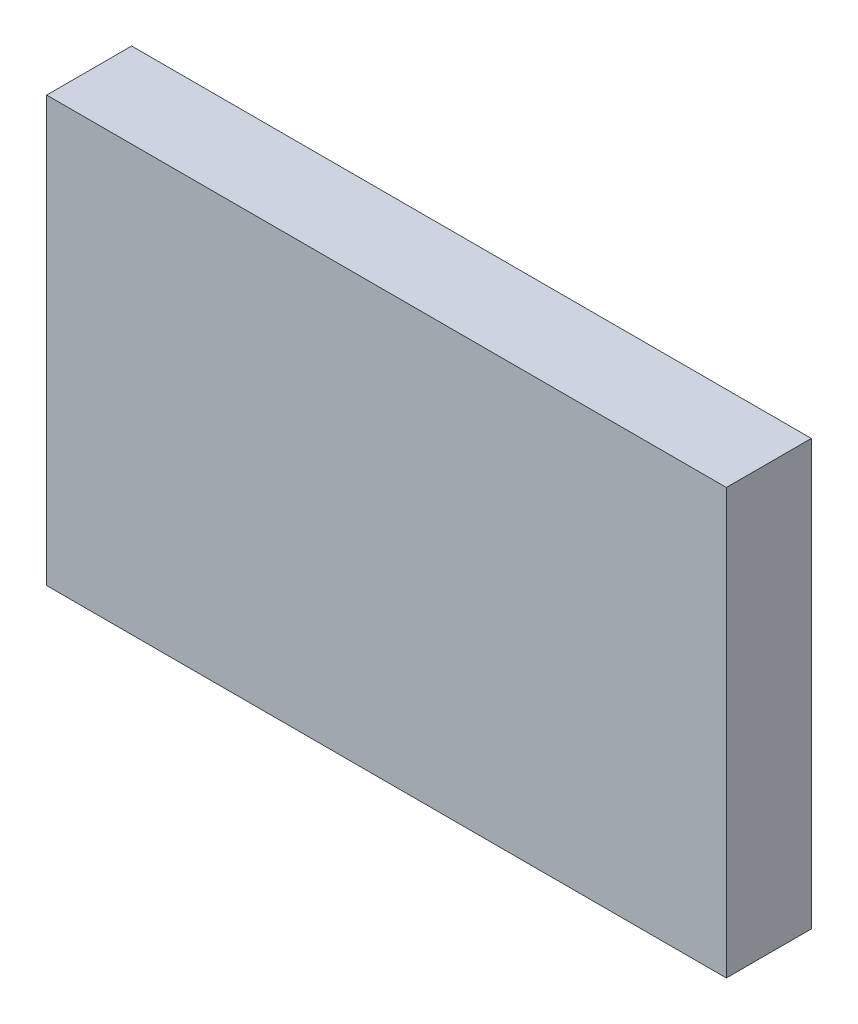
ISO-10303-21;
HEADER;
FILE_DESCRIPTION(('STEP AP214'),'2;1');
FILE_NAME('part.step','',(''),(''),'','','');
FILE_SCHEMA(('AUTOMOTIVE_DESIGN { 1 0 10303 214 1 1 1 1 }'));
ENDSEC;
DATA;
#1=APPLICATION_CONTEXT('core data for automotive mechanical design processes');
#2=APPLICATION_PROTOCOL_DEFINITION('international standard','automotive_design',2000,#1);
#3=PRODUCT_CONTEXT('',#1,'mechanical');
#4=PRODUCT('Part','Part','',(#3));
#5=PRODUCT_RELATED_PRODUCT_CATEGORY('part','',(#4));
#6=PRODUCT_DEFINITION_FORMATION('','',#4);
#7=PRODUCT_DEFINITION_CONTEXT('part definition',#1,'design');
#8=PRODUCT_DEFINITION('design','',#6,#7);
#9=PRODUCT_DEFINITION_SHAPE('','',#8);
#10=(LENGTH_UNIT() NAMED_UNIT(*) SI_UNIT(.MILLI.,.METRE.));
#11=(NAMED_UNIT(*) PLANE_ANGLE_UNIT() SI_UNIT($,.RADIAN.));
#12=(NAMED_UNIT(*) SI_UNIT($,.STERADIAN.) SOLID_ANGLE_UNIT());
#13=UNCERTAINTY_MEASURE_WITH_UNIT(LENGTH_MEASURE(1.E-05),#10,'distance_accuracy_value','');
#14=(GEOMETRIC_REPRESENTATION_CONTEXT(3) GLOBAL_UNCERTAINTY_ASSIGNED_CONTEXT((#13)) GLOBAL_UNIT_ASSIGNED_CONTEXT((#10,
#11,#12)) REPRESENTATION_CONTEXT('',''));
#15=CARTESIAN_POINT('',(0.,0.,0.));
#16=DIRECTION('',(0.,0.,1.));
#17=DIRECTION('',(1.,0.,0.));
#18=AXIS2_PLACEMENT_3D('',#15,#16,#17);
#19=CARTESIAN_POINT('',(40.,-25.,10.));
#20=DIRECTION('',(-1.,0.,0.));
#21=DIRECTION('',(0.,0.,1.));
#22=AXIS2_PLACEMENT_3D('',#19,#20,#21);
#23=PLANE('',#22);
#24=DIRECTION('',(0.,1.,0.));
#25=VECTOR('',#24,1.);
#26=CARTESIAN_POINT('',(40.,-25.,0.));
#27=LINE('',#26,#25);
#28=CARTESIAN_POINT('',(40.,-25.,0.));
#29=VERTEX_POINT('',#28);
#30=CARTESIAN_POINT('',(40.,25.,0.));
#31=VERTEX_POINT('',#30);
#32=EDGE_CURVE('E108',#29,#31,#27,.T.);
#33=ORIENTED_EDGE('',*,*,#32,.T.);
#34=DIRECTION('',(0.,0.,-1.));
#35=VECTOR('',#34,1.);
#36=CARTESIAN_POINT('',(40.,25.,10.));
#37=LINE('',#36,#35);
#38=CARTESIAN_POINT('',(40.,25.,10.));
#39=VERTEX_POINT('',#38);
#40=EDGE_CURVE('E11',#39,#31,#37,.T.);
#41=ORIENTED_EDGE('',*,*,#40,.F.);
#42=DIRECTION('',(0.,1.,0.));
#43=VECTOR('',#42,1.);
#44=CARTESIAN_POINT('',(40.,-25.,10.));
#45=LINE('',#44,#43);
#46=CARTESIAN_POINT('',(40.,-25.,10.));
#47=VERTEX_POINT('',#46);
#48=EDGE_CURVE('E96',#47,#39,#45,.T.);
#49=ORIENTED_EDGE('',*,*,#48,.F.);
#50=DIRECTION('',(0.,0.,-1.));
#51=VECTOR('',#50,1.);
#52=CARTESIAN_POINT('',(40.,-25.,10.));
#53=LINE('',#52,#51);
#54=EDGE_CURVE('E104',#47,#29,#53,.T.);
#55=ORIENTED_EDGE('',*,*,#54,.T.);
#56=EDGE_LOOP('',(#33,#41,#49,#55));
#57=FACE_BOUND('',#56,.T.);
#58=ADVANCED_FACE('F45',(#57),#23,.F.);
#59=CARTESIAN_POINT('',(-40.,25.,10.));
#60=DIRECTION('',(0.,-1.,0.));
#61=DIRECTION('',(0.,0.,-1.));
#62=AXIS2_PLACEMENT_3D('',#59,#60,#61);
#63=PLANE('',#62);
#64=DIRECTION('',(-1.,0.,0.));
#65=VECTOR('',#64,1.);
#66=CARTESIAN_POINT('',(-40.,25.,0.));
#67=LINE('',#66,#65);
#68=CARTESIAN_POINT('',(-40.,25.,0.));
#69=VERTEX_POINT('',#68);
#70=EDGE_CURVE('E100',#31,#69,#67,.T.);
#71=ORIENTED_EDGE('',*,*,#70,.T.);
#72=DIRECTION('',(0.,0.,-1.));
#73=VECTOR('',#72,1.);
#74=CARTESIAN_POINT('',(-40.,25.,10.));
#75=LINE('',#74,#73);
#76=CARTESIAN_POINT('',(-40.,25.,10.));
#77=VERTEX_POINT('',#76);
#78=EDGE_CURVE('E53',#77,#69,#75,.T.);
#79=ORIENTED_EDGE('',*,*,#78,.F.);
#80=DIRECTION('',(-1.,0.,0.));
#81=VECTOR('',#80,1.);
#82=CARTESIAN_POINT('',(-40.,25.,10.));
#83=LINE('',#82,#81);
#84=EDGE_CURVE('E91',#39,#77,#83,.T.);
#85=ORIENTED_EDGE('',*,*,#84,.F.);
#86=ORIENTED_EDGE('',*,*,#40,.T.);
#87=EDGE_LOOP('',(#71,#79,#85,#86));
#88=FACE_BOUND('',#87,.T.);
#89=ADVANCED_FACE('F99',(#88),#63,.F.);
#90=CARTESIAN_POINT('',(-40.,-25.,10.));
#91=DIRECTION('',(1.,0.,0.));
#92=DIRECTION('',(0.,0.,-1.));
#93=AXIS2_PLACEMENT_3D('',#90,#91,#92);
#94=PLANE('',#93);
#95=DIRECTION('',(0.,-1.,0.));
#96=VECTOR('',#95,1.);
#97=CARTESIAN_POINT('',(-40.,-25.,0.));
#98=LINE('',#97,#96);
#99=CARTESIAN_POINT('',(-40.,-25.,0.));
#100=VERTEX_POINT('',#99);
#101=EDGE_CURVE('E78',#69,#100,#98,.T.);
#102=ORIENTED_EDGE('',*,*,#101,.T.);
#103=DIRECTION('',(0.,0.,-1.));
#104=VECTOR('',#103,1.);
#105=CARTESIAN_POINT('',(-40.,-25.,10.));
#106=LINE('',#105,#104);
#107=CARTESIAN_POINT('',(-40.,-25.,10.));
#108=VERTEX_POINT('',#107);
#109=EDGE_CURVE('E101',#108,#100,#106,.T.);
#110=ORIENTED_EDGE('',*,*,#109,.F.);
#111=DIRECTION('',(0.,-1.,0.));
#112=VECTOR('',#111,1.);
#113=CARTESIAN_POINT('',(-40.,-25.,10.));
#114=LINE('',#113,#112);
#115=EDGE_CURVE('E94',#77,#108,#114,.T.);
#116=ORIENTED_EDGE('',*,*,#115,.F.);
#117=ORIENTED_EDGE('',*,*,#78,.T.);
#118=EDGE_LOOP('',(#102,#110,#116,#117));
#119=FACE_BOUND('',#118,.T.);
#120=ADVANCED_FACE('F102',(#119),#94,.F.);
#121=CARTESIAN_POINT('',(-40.,-25.,10.));
#122=DIRECTION('',(0.,1.,0.));
#123=DIRECTION('',(0.,0.,1.));
#124=AXIS2_PLACEMENT_3D('',#121,#122,#123);
#125=PLANE('',#124);
#126=DIRECTION('',(1.,0.,0.));
#127=VECTOR('',#126,1.);
#128=CARTESIAN_POINT('',(-40.,-25.,0.));
#129=LINE('',#128,#127);
#130=EDGE_CURVE('E84',#100,#29,#129,.T.);
#131=ORIENTED_EDGE('',*,*,#130,.T.);
#132=ORIENTED_EDGE('',*,*,#54,.F.);
#133=DIRECTION('',(1.,0.,0.));
#134=VECTOR('',#133,1.);
#135=CARTESIAN_POINT('',(-40.,-25.,10.));
#136=LINE('',#135,#134);
#137=EDGE_CURVE('E61',#108,#47,#136,.T.);
#138=ORIENTED_EDGE('',*,*,#137,.F.);
#139=ORIENTED_EDGE('',*,*,#109,.T.);
#140=EDGE_LOOP('',(#131,#132,#138,#139));
#141=FACE_BOUND('',#140,.T.);
#142=ADVANCED_FACE('F115',(#141),#125,.F.);
#143=CARTESIAN_POINT('',(0.,0.,10.));
#144=DIRECTION('',(0.,0.,-1.));
#145=DIRECTION('',(-1.,0.,0.));
#146=AXIS2_PLACEMENT_3D('',#143,#144,#145);
#147=PLANE('',#146);
#148=ORIENTED_EDGE('',*,*,#48,.T.);
#149=ORIENTED_EDGE('',*,*,#84,.T.);
#150=ORIENTED_EDGE('',*,*,#115,.T.);
#151=ORIENTED_EDGE('',*,*,#137,.T.);
#152=EDGE_LOOP('',(#148,#149,#150,#151));
#153=FACE_BOUND('',#152,.T.);
#154=ADVANCED_FACE('F92',(#153),#147,.F.);
#155=CARTESIAN_POINT('',(0.,0.,0.));
#156=DIRECTION('',(0.,0.,-1.));
#157=DIRECTION('',(-1.,0.,0.));
#158=AXIS2_PLACEMENT_3D('',#155,#156,#157);
#159=PLANE('',#158);
#160=ORIENTED_EDGE('',*,*,#32,.F.);
#161=ORIENTED_EDGE('',*,*,#130,.F.);
#162=ORIENTED_EDGE('',*,*,#101,.F.);
#163=ORIENTED_EDGE('',*,*,#70,.F.);
#164=EDGE_LOOP('',(#160,#161,#162,#163));
#165=FACE_BOUND('',#164,.T.);
#166=ADVANCED_FACE('F118',(#165),#159,.T.);
#167=CLOSED_SHELL('',(#58,#89,#120,#142,#154,#166));
#168=MANIFOLD_SOLID_BREP('B2',#167);
#169=ADVANCED_BREP_SHAPE_REPRESENTATION('',(#18,#168),#14);
#170=SHAPE_DEFINITION_REPRESENTATION(#9,#169);
ENDSEC;
END-ISO-10303-21;
